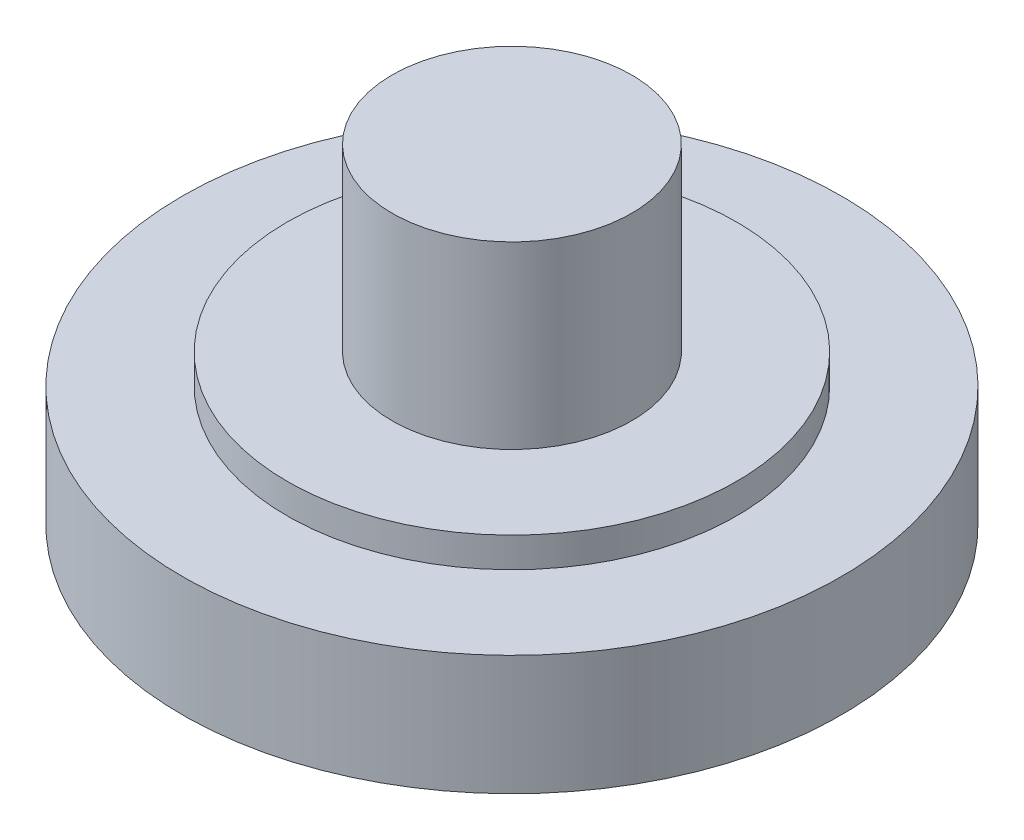
ISO-10303-21;
HEADER;
FILE_DESCRIPTION(('STEP AP214'),'2;1');
FILE_NAME('part.step','',(''),(''),'','','');
FILE_SCHEMA(('AUTOMOTIVE_DESIGN { 1 0 10303 214 1 1 1 1 }'));
ENDSEC;
DATA;
#1=APPLICATION_CONTEXT('core data for automotive mechanical design processes');
#2=APPLICATION_PROTOCOL_DEFINITION('international standard','automotive_design',2000,#1);
#3=PRODUCT_CONTEXT('',#1,'mechanical');
#4=PRODUCT('Part','Part','',(#3));
#5=PRODUCT_RELATED_PRODUCT_CATEGORY('part','',(#4));
#6=PRODUCT_DEFINITION_FORMATION('','',#4);
#7=PRODUCT_DEFINITION_CONTEXT('part definition',#1,'design');
#8=PRODUCT_DEFINITION('design','',#6,#7);
#9=PRODUCT_DEFINITION_SHAPE('','',#8);
#10=(LENGTH_UNIT() NAMED_UNIT(*) SI_UNIT(.MILLI.,.METRE.));
#11=(NAMED_UNIT(*) PLANE_ANGLE_UNIT() SI_UNIT($,.RADIAN.));
#12=(NAMED_UNIT(*) SI_UNIT($,.STERADIAN.) SOLID_ANGLE_UNIT());
#13=UNCERTAINTY_MEASURE_WITH_UNIT(LENGTH_MEASURE(1.E-05),#10,'distance_accuracy_value','');
#14=(GEOMETRIC_REPRESENTATION_CONTEXT(3) GLOBAL_UNCERTAINTY_ASSIGNED_CONTEXT((#13)) GLOBAL_UNIT_ASSIGNED_CONTEXT((#10,
#11,#12)) REPRESENTATION_CONTEXT('',''));
#15=CARTESIAN_POINT('',(0.,0.,0.));
#16=DIRECTION('',(0.,0.,1.));
#17=DIRECTION('',(1.,0.,0.));
#18=AXIS2_PLACEMENT_3D('',#15,#16,#17);
#19=CARTESIAN_POINT('',(0.,0.,0.));
#20=DIRECTION('',(0.,1.,0.));
#21=DIRECTION('',(-1.,0.,0.));
#22=AXIS2_PLACEMENT_3D('',#19,#20,#21);
#23=PLANE('',#22);
#24=CARTESIAN_POINT('',(0.,0.,0.));
#25=DIRECTION('',(0.,1.,0.));
#26=DIRECTION('',(-1.,0.,0.));
#27=AXIS2_PLACEMENT_3D('',#24,#25,#26);
#28=CIRCLE('',#27,5.5);
#29=CARTESIAN_POINT('',(-5.5,0.,0.));
#30=VERTEX_POINT('',#29);
#31=EDGE_CURVE('E10',#30,#30,#28,.T.);
#32=ORIENTED_EDGE('',*,*,#31,.F.);
#33=EDGE_LOOP('',(#32));
#34=FACE_BOUND('',#33,.T.);
#35=ADVANCED_FACE('F31',(#34),#23,.F.);
#36=CARTESIAN_POINT('',(0.,5.5,0.));
#37=DIRECTION('',(0.,1.,0.));
#38=DIRECTION('',(-1.,0.,0.));
#39=AXIS2_PLACEMENT_3D('',#36,#37,#38);
#40=CYLINDRICAL_SURFACE('',#39,5.5);
#41=CARTESIAN_POINT('',(0.,2.,0.));
#42=DIRECTION('',(0.,1.,0.));
#43=DIRECTION('',(-1.,0.,0.));
#44=AXIS2_PLACEMENT_3D('',#41,#42,#43);
#45=CIRCLE('',#44,5.5);
#46=CARTESIAN_POINT('',(-5.5,2.,0.));
#47=VERTEX_POINT('',#46);
#48=EDGE_CURVE('E37',#47,#47,#45,.T.);
#49=ORIENTED_EDGE('',*,*,#48,.F.);
#50=EDGE_LOOP('',(#49));
#51=FACE_BOUND('',#50,.T.);
#52=ORIENTED_EDGE('',*,*,#31,.T.);
#53=EDGE_LOOP('',(#52));
#54=FACE_BOUND('',#53,.T.);
#55=ADVANCED_FACE('F79',(#51,#54),#40,.T.);
#56=CARTESIAN_POINT('',(5.5,2.,0.));
#57=DIRECTION('',(0.,-1.,0.));
#58=DIRECTION('',(1.,0.,0.));
#59=AXIS2_PLACEMENT_3D('',#56,#57,#58);
#60=PLANE('',#59);
#61=CARTESIAN_POINT('',(0.,2.,0.));
#62=DIRECTION('',(0.,1.,0.));
#63=DIRECTION('',(-1.,0.,0.));
#64=AXIS2_PLACEMENT_3D('',#61,#62,#63);
#65=CIRCLE('',#64,3.75);
#66=CARTESIAN_POINT('',(-3.75,2.,0.));
#67=VERTEX_POINT('',#66);
#68=EDGE_CURVE('E41',#67,#67,#65,.T.);
#69=ORIENTED_EDGE('',*,*,#68,.F.);
#70=EDGE_LOOP('',(#69));
#71=FACE_BOUND('',#70,.T.);
#72=ORIENTED_EDGE('',*,*,#48,.T.);
#73=EDGE_LOOP('',(#72));
#74=FACE_BOUND('',#73,.T.);
#75=ADVANCED_FACE('F74',(#71,#74),#60,.F.);
#76=CARTESIAN_POINT('',(0.,5.5,0.));
#77=DIRECTION('',(0.,1.,0.));
#78=DIRECTION('',(-1.,0.,0.));
#79=AXIS2_PLACEMENT_3D('',#76,#77,#78);
#80=CYLINDRICAL_SURFACE('',#79,3.75);
#81=CARTESIAN_POINT('',(0.,2.5,0.));
#82=DIRECTION('',(0.,1.,0.));
#83=DIRECTION('',(-1.,0.,0.));
#84=AXIS2_PLACEMENT_3D('',#81,#82,#83);
#85=CIRCLE('',#84,3.75);
#86=CARTESIAN_POINT('',(-3.75,2.5,0.));
#87=VERTEX_POINT('',#86);
#88=EDGE_CURVE('E45',#87,#87,#85,.T.);
#89=ORIENTED_EDGE('',*,*,#88,.F.);
#90=EDGE_LOOP('',(#89));
#91=FACE_BOUND('',#90,.T.);
#92=ORIENTED_EDGE('',*,*,#68,.T.);
#93=EDGE_LOOP('',(#92));
#94=FACE_BOUND('',#93,.T.);
#95=ADVANCED_FACE('F68',(#91,#94),#80,.T.);
#96=CARTESIAN_POINT('',(3.75,2.5,0.));
#97=DIRECTION('',(0.,-1.,0.));
#98=DIRECTION('',(1.,0.,0.));
#99=AXIS2_PLACEMENT_3D('',#96,#97,#98);
#100=PLANE('',#99);
#101=CARTESIAN_POINT('',(0.,2.5,0.));
#102=DIRECTION('',(0.,1.,0.));
#103=DIRECTION('',(-1.,0.,0.));
#104=AXIS2_PLACEMENT_3D('',#101,#102,#103);
#105=CIRCLE('',#104,2.);
#106=CARTESIAN_POINT('',(-2.,2.5,0.));
#107=VERTEX_POINT('',#106);
#108=EDGE_CURVE('E50',#107,#107,#105,.T.);
#109=ORIENTED_EDGE('',*,*,#108,.F.);
#110=EDGE_LOOP('',(#109));
#111=FACE_BOUND('',#110,.T.);
#112=ORIENTED_EDGE('',*,*,#88,.T.);
#113=EDGE_LOOP('',(#112));
#114=FACE_BOUND('',#113,.T.);
#115=ADVANCED_FACE('F62',(#111,#114),#100,.F.);
#116=CARTESIAN_POINT('',(0.,5.5,0.));
#117=DIRECTION('',(0.,1.,0.));
#118=DIRECTION('',(-1.,0.,0.));
#119=AXIS2_PLACEMENT_3D('',#116,#117,#118);
#120=CYLINDRICAL_SURFACE('',#119,2.);
#121=CARTESIAN_POINT('',(0.,5.5,0.));
#122=DIRECTION('',(0.,1.,0.));
#123=DIRECTION('',(-1.,0.,0.));
#124=AXIS2_PLACEMENT_3D('',#121,#122,#123);
#125=CIRCLE('',#124,2.);
#126=CARTESIAN_POINT('',(-2.,5.5,0.));
#127=VERTEX_POINT('',#126);
#128=EDGE_CURVE('E53',#127,#127,#125,.T.);
#129=ORIENTED_EDGE('',*,*,#128,.F.);
#130=EDGE_LOOP('',(#129));
#131=FACE_BOUND('',#130,.T.);
#132=ORIENTED_EDGE('',*,*,#108,.T.);
#133=EDGE_LOOP('',(#132));
#134=FACE_BOUND('',#133,.T.);
#135=ADVANCED_FACE('F59',(#131,#134),#120,.T.);
#136=CARTESIAN_POINT('',(2.,5.5,0.));
#137=DIRECTION('',(0.,-1.,0.));
#138=DIRECTION('',(1.,0.,0.));
#139=AXIS2_PLACEMENT_3D('',#136,#137,#138);
#140=PLANE('',#139);
#141=ORIENTED_EDGE('',*,*,#128,.T.);
#142=EDGE_LOOP('',(#141));
#143=FACE_BOUND('',#142,.T.);
#144=ADVANCED_FACE('F57',(#143),#140,.F.);
#145=CLOSED_SHELL('',(#35,#55,#75,#95,#115,#135,#144));
#146=MANIFOLD_SOLID_BREP('B2',#145);
#147=ADVANCED_BREP_SHAPE_REPRESENTATION('',(#18,#146),#14);
#148=SHAPE_DEFINITION_REPRESENTATION(#9,#147);
ENDSEC;
END-ISO-10303-21;
